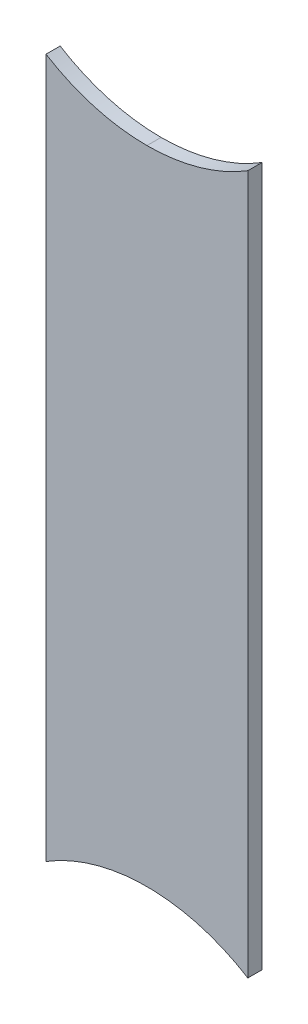
ISO-10303-21;
HEADER;
FILE_DESCRIPTION(('STEP AP214'),'2;1');
FILE_NAME('part.step','',(''),(''),'','','');
FILE_SCHEMA(('AUTOMOTIVE_DESIGN { 1 0 10303 214 1 1 1 1 }'));
ENDSEC;
DATA;
#1=APPLICATION_CONTEXT('core data for automotive mechanical design processes');
#2=APPLICATION_PROTOCOL_DEFINITION('international standard','automotive_design',2000,#1);
#3=PRODUCT_CONTEXT('',#1,'mechanical');
#4=PRODUCT('Part','Part','',(#3));
#5=PRODUCT_RELATED_PRODUCT_CATEGORY('part','',(#4));
#6=PRODUCT_DEFINITION_FORMATION('','',#4);
#7=PRODUCT_DEFINITION_CONTEXT('part definition',#1,'design');
#8=PRODUCT_DEFINITION('design','',#6,#7);
#9=PRODUCT_DEFINITION_SHAPE('','',#8);
#10=(LENGTH_UNIT() NAMED_UNIT(*) SI_UNIT(.MILLI.,.METRE.));
#11=(NAMED_UNIT(*) PLANE_ANGLE_UNIT() SI_UNIT($,.RADIAN.));
#12=(NAMED_UNIT(*) SI_UNIT($,.STERADIAN.) SOLID_ANGLE_UNIT());
#13=UNCERTAINTY_MEASURE_WITH_UNIT(LENGTH_MEASURE(1.E-05),#10,'distance_accuracy_value','');
#14=(GEOMETRIC_REPRESENTATION_CONTEXT(3) GLOBAL_UNCERTAINTY_ASSIGNED_CONTEXT((#13)) GLOBAL_UNIT_ASSIGNED_CONTEXT((#10,
#11,#12)) REPRESENTATION_CONTEXT('',''));
#15=CARTESIAN_POINT('',(0.,0.,0.));
#16=DIRECTION('',(0.,0.,1.));
#17=DIRECTION('',(1.,0.,0.));
#18=AXIS2_PLACEMENT_3D('',#15,#16,#17);
#19=CARTESIAN_POINT('',(131.56,-51.23,1.6));
#20=DIRECTION('',(-1.,0.,0.));
#21=DIRECTION('',(0.,0.,1.));
#22=AXIS2_PLACEMENT_3D('',#19,#20,#21);
#23=PLANE('',#22);
#24=DIRECTION('',(0.,0.,-1.));
#25=VECTOR('',#24,1.);
#26=CARTESIAN_POINT('',(131.56,-49.09388736053,-0.045));
#27=LINE('',#26,#25);
#28=CARTESIAN_POINT('',(131.56,-49.09388736053,1.635));
#29=VERTEX_POINT('',#28);
#30=CARTESIAN_POINT('',(131.56,-49.09388736053,1.6));
#31=VERTEX_POINT('',#30);
#32=EDGE_CURVE('E11',#29,#31,#27,.T.);
#33=ORIENTED_EDGE('',*,*,#32,.F.);
#34=DIRECTION('',(0.,1.,0.));
#35=VECTOR('',#34,1.);
#36=CARTESIAN_POINT('',(131.56,-51.23,1.635));
#37=LINE('',#36,#35);
#38=CARTESIAN_POINT('',(131.56,-50.82611263947,1.635));
#39=VERTEX_POINT('',#38);
#40=EDGE_CURVE('E121',#39,#29,#37,.T.);
#41=ORIENTED_EDGE('',*,*,#40,.F.);
#42=DIRECTION('',(0.,0.,-1.));
#43=VECTOR('',#42,1.);
#44=CARTESIAN_POINT('',(131.56,-50.82611263946,-0.045));
#45=LINE('',#44,#43);
#46=CARTESIAN_POINT('',(131.56,-50.82611263947,1.6));
#47=VERTEX_POINT('',#46);
#48=EDGE_CURVE('E83',#39,#47,#45,.T.);
#49=ORIENTED_EDGE('',*,*,#48,.T.);
#50=DIRECTION('',(0.,1.,0.));
#51=VECTOR('',#50,1.);
#52=CARTESIAN_POINT('',(131.56,-51.23,1.6));
#53=LINE('',#52,#51);
#54=EDGE_CURVE('E113',#47,#31,#53,.T.);
#55=ORIENTED_EDGE('',*,*,#54,.T.);
#56=EDGE_LOOP('',(#33,#41,#49,#55));
#57=FACE_BOUND('',#56,.T.);
#58=ADVANCED_FACE('F17',(#57),#23,.F.);
#59=CARTESIAN_POINT('',(131.31,-48.69,-0.045));
#60=DIRECTION('',(0.,0.,-1.));
#61=DIRECTION('',(0.,-1.,0.));
#62=AXIS2_PLACEMENT_3D('',#59,#60,#61);
#63=CYLINDRICAL_SURFACE('',#62,0.475);
#64=CARTESIAN_POINT('',(131.31,-48.69,1.6));
#65=DIRECTION('',(0.,0.,-1.));
#66=DIRECTION('',(0.,-1.,0.));
#67=AXIS2_PLACEMENT_3D('',#64,#65,#66);
#68=CIRCLE('',#67,0.475);
#69=CARTESIAN_POINT('',(131.31,-49.165,1.6));
#70=VERTEX_POINT('',#69);
#71=EDGE_CURVE('E110',#31,#70,#68,.T.);
#72=ORIENTED_EDGE('',*,*,#71,.T.);
#73=DIRECTION('',(0.,0.,1.));
#74=VECTOR('',#73,1.);
#75=CARTESIAN_POINT('',(131.31,-49.165,-0.045));
#76=LINE('',#75,#74);
#77=CARTESIAN_POINT('',(131.31,-49.165,1.635));
#78=VERTEX_POINT('',#77);
#79=EDGE_CURVE('E25',#70,#78,#76,.T.);
#80=ORIENTED_EDGE('',*,*,#79,.T.);
#81=CARTESIAN_POINT('',(131.31,-48.69,1.635));
#82=DIRECTION('',(0.,0.,-1.));
#83=DIRECTION('',(0.,-1.,0.));
#84=AXIS2_PLACEMENT_3D('',#81,#82,#83);
#85=CIRCLE('',#84,0.475);
#86=EDGE_CURVE('E118',#29,#78,#85,.T.);
#87=ORIENTED_EDGE('',*,*,#86,.F.);
#88=ORIENTED_EDGE('',*,*,#32,.T.);
#89=EDGE_LOOP('',(#72,#80,#87,#88));
#90=FACE_BOUND('',#89,.T.);
#91=ADVANCED_FACE('F224',(#90),#63,.F.);
#92=CARTESIAN_POINT('',(131.31,-48.69,-0.045));
#93=DIRECTION('',(0.,0.,-1.));
#94=DIRECTION('',(0.,-1.,0.));
#95=AXIS2_PLACEMENT_3D('',#92,#93,#94);
#96=CYLINDRICAL_SURFACE('',#95,0.475);
#97=ORIENTED_EDGE('',*,*,#79,.F.);
#98=CARTESIAN_POINT('',(131.31,-48.69,1.6));
#99=DIRECTION('',(0.,0.,-1.));
#100=DIRECTION('',(0.,-1.,0.));
#101=AXIS2_PLACEMENT_3D('',#98,#99,#100);
#102=CIRCLE('',#101,0.475);
#103=CARTESIAN_POINT('',(131.06,-49.09388736054,1.6));
#104=VERTEX_POINT('',#103);
#105=EDGE_CURVE('E87',#70,#104,#102,.T.);
#106=ORIENTED_EDGE('',*,*,#105,.T.);
#107=DIRECTION('',(0.,0.,-1.));
#108=VECTOR('',#107,1.);
#109=CARTESIAN_POINT('',(131.06,-49.09388736053,-0.045));
#110=LINE('',#109,#108);
#111=CARTESIAN_POINT('',(131.06,-49.09388736054,1.635));
#112=VERTEX_POINT('',#111);
#113=EDGE_CURVE('E98',#112,#104,#110,.T.);
#114=ORIENTED_EDGE('',*,*,#113,.F.);
#115=CARTESIAN_POINT('',(131.31,-48.69,1.635));
#116=DIRECTION('',(0.,0.,-1.));
#117=DIRECTION('',(0.,-1.,0.));
#118=AXIS2_PLACEMENT_3D('',#115,#116,#117);
#119=CIRCLE('',#118,0.475);
#120=EDGE_CURVE('E93',#78,#112,#119,.T.);
#121=ORIENTED_EDGE('',*,*,#120,.F.);
#122=EDGE_LOOP('',(#97,#106,#114,#121));
#123=FACE_BOUND('',#122,.T.);
#124=ADVANCED_FACE('F215',(#123),#96,.F.);
#125=CARTESIAN_POINT('',(131.06,-48.69,1.635));
#126=DIRECTION('',(0.,0.,1.));
#127=DIRECTION('',(1.,0.,0.));
#128=AXIS2_PLACEMENT_3D('',#125,#126,#127);
#129=PLANE('',#128);
#130=ORIENTED_EDGE('',*,*,#120,.T.);
#131=DIRECTION('',(0.,-1.,0.));
#132=VECTOR('',#131,1.);
#133=CARTESIAN_POINT('',(131.06,-48.69,1.635));
#134=LINE('',#133,#132);
#135=CARTESIAN_POINT('',(131.06,-50.82611263946,1.635));
#136=VERTEX_POINT('',#135);
#137=EDGE_CURVE('E90',#112,#136,#134,.T.);
#138=ORIENTED_EDGE('',*,*,#137,.T.);
#139=CARTESIAN_POINT('',(131.31,-51.23,1.635));
#140=DIRECTION('',(0.,0.,-1.));
#141=DIRECTION('',(0.,-1.,0.));
#142=AXIS2_PLACEMENT_3D('',#139,#140,#141);
#143=CIRCLE('',#142,0.475);
#144=EDGE_CURVE('E77',#136,#39,#143,.T.);
#145=ORIENTED_EDGE('',*,*,#144,.T.);
#146=ORIENTED_EDGE('',*,*,#40,.T.);
#147=ORIENTED_EDGE('',*,*,#86,.T.);
#148=EDGE_LOOP('',(#130,#138,#145,#146,#147));
#149=FACE_BOUND('',#148,.T.);
#150=ADVANCED_FACE('F91',(#149),#129,.T.);
#151=CARTESIAN_POINT('',(131.31,-51.23,-0.045));
#152=DIRECTION('',(0.,0.,-1.));
#153=DIRECTION('',(0.,-1.,0.));
#154=AXIS2_PLACEMENT_3D('',#151,#152,#153);
#155=CYLINDRICAL_SURFACE('',#154,0.475);
#156=ORIENTED_EDGE('',*,*,#144,.F.);
#157=DIRECTION('',(0.,0.,-1.));
#158=VECTOR('',#157,1.);
#159=CARTESIAN_POINT('',(131.06,-50.82611263946,-0.045));
#160=LINE('',#159,#158);
#161=CARTESIAN_POINT('',(131.06,-50.82611263946,1.6));
#162=VERTEX_POINT('',#161);
#163=EDGE_CURVE('E82',#136,#162,#160,.T.);
#164=ORIENTED_EDGE('',*,*,#163,.T.);
#165=CARTESIAN_POINT('',(131.31,-51.23,1.6));
#166=DIRECTION('',(0.,0.,-1.));
#167=DIRECTION('',(0.,-1.,0.));
#168=AXIS2_PLACEMENT_3D('',#165,#166,#167);
#169=CIRCLE('',#168,0.475);
#170=EDGE_CURVE('E124',#162,#47,#169,.T.);
#171=ORIENTED_EDGE('',*,*,#170,.T.);
#172=ORIENTED_EDGE('',*,*,#48,.F.);
#173=EDGE_LOOP('',(#156,#164,#171,#172));
#174=FACE_BOUND('',#173,.T.);
#175=ADVANCED_FACE('F79',(#174),#155,.F.);
#176=CARTESIAN_POINT('',(131.06,-48.69,1.6));
#177=DIRECTION('',(0.,0.,1.));
#178=DIRECTION('',(1.,0.,0.));
#179=AXIS2_PLACEMENT_3D('',#176,#177,#178);
#180=PLANE('',#179);
#181=ORIENTED_EDGE('',*,*,#71,.F.);
#182=ORIENTED_EDGE('',*,*,#54,.F.);
#183=ORIENTED_EDGE('',*,*,#170,.F.);
#184=DIRECTION('',(0.,-1.,0.));
#185=VECTOR('',#184,1.);
#186=CARTESIAN_POINT('',(131.06,-48.69,1.6));
#187=LINE('',#186,#185);
#188=EDGE_CURVE('E103',#104,#162,#187,.T.);
#189=ORIENTED_EDGE('',*,*,#188,.F.);
#190=ORIENTED_EDGE('',*,*,#105,.F.);
#191=EDGE_LOOP('',(#181,#182,#183,#189,#190));
#192=FACE_BOUND('',#191,.T.);
#193=ADVANCED_FACE('F187',(#192),#180,.F.);
#194=CARTESIAN_POINT('',(131.06,-48.69,1.6));
#195=DIRECTION('',(1.,0.,0.));
#196=DIRECTION('',(0.,1.,0.));
#197=AXIS2_PLACEMENT_3D('',#194,#195,#196);
#198=PLANE('',#197);
#199=ORIENTED_EDGE('',*,*,#163,.F.);
#200=ORIENTED_EDGE('',*,*,#137,.F.);
#201=ORIENTED_EDGE('',*,*,#113,.T.);
#202=ORIENTED_EDGE('',*,*,#188,.T.);
#203=EDGE_LOOP('',(#199,#200,#201,#202));
#204=FACE_BOUND('',#203,.T.);
#205=ADVANCED_FACE('F101',(#204),#198,.F.);
#206=CLOSED_SHELL('',(#58,#91,#124,#150,#175,#193,#205));
#207=MANIFOLD_SOLID_BREP('B1',#206);
#208=ADVANCED_BREP_SHAPE_REPRESENTATION('',(#18,#207),#14);
#209=SHAPE_DEFINITION_REPRESENTATION(#9,#208);
ENDSEC;
END-ISO-10303-21;
